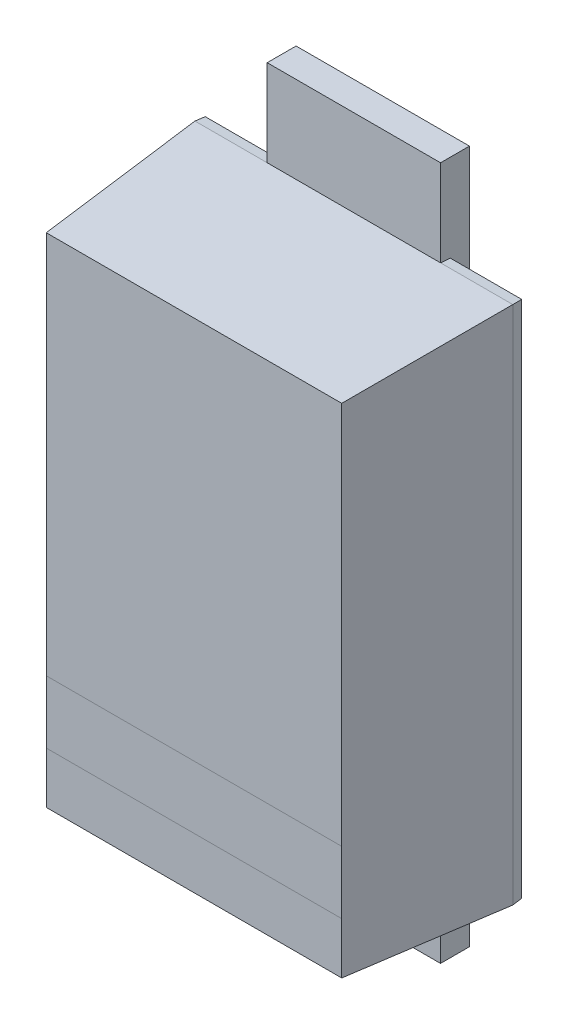
ISO-10303-21;
HEADER;
FILE_DESCRIPTION(('STEP AP214'),'2;1');
FILE_NAME('part.step','',(''),(''),'','','');
FILE_SCHEMA(('AUTOMOTIVE_DESIGN { 1 0 10303 214 1 1 1 1 }'));
ENDSEC;
DATA;
#1=APPLICATION_CONTEXT('core data for automotive mechanical design processes');
#2=APPLICATION_PROTOCOL_DEFINITION('international standard','automotive_design',2000,#1);
#3=PRODUCT_CONTEXT('',#1,'mechanical');
#4=PRODUCT('Part','Part','',(#3));
#5=PRODUCT_RELATED_PRODUCT_CATEGORY('part','',(#4));
#6=PRODUCT_DEFINITION_FORMATION('','',#4);
#7=PRODUCT_DEFINITION_CONTEXT('part definition',#1,'design');
#8=PRODUCT_DEFINITION('design','',#6,#7);
#9=PRODUCT_DEFINITION_SHAPE('','',#8);
#10=(LENGTH_UNIT() NAMED_UNIT(*) SI_UNIT(.MILLI.,.METRE.));
#11=(NAMED_UNIT(*) PLANE_ANGLE_UNIT() SI_UNIT($,.RADIAN.));
#12=(NAMED_UNIT(*) SI_UNIT($,.STERADIAN.) SOLID_ANGLE_UNIT());
#13=UNCERTAINTY_MEASURE_WITH_UNIT(LENGTH_MEASURE(1.E-05),#10,'distance_accuracy_value','');
#14=(GEOMETRIC_REPRESENTATION_CONTEXT(3) GLOBAL_UNCERTAINTY_ASSIGNED_CONTEXT((#13)) GLOBAL_UNIT_ASSIGNED_CONTEXT((#10,
#11,#12)) REPRESENTATION_CONTEXT('',''));
#15=CARTESIAN_POINT('',(0.,0.,0.));
#16=DIRECTION('',(0.,0.,1.));
#17=DIRECTION('',(1.,0.,0.));
#18=AXIS2_PLACEMENT_3D('',#15,#16,#17);
#19=CARTESIAN_POINT('',(16.9501000976563,42.6,0.));
#20=DIRECTION('',(0.,0.,1.));
#21=DIRECTION('',(0.,-1.,0.));
#22=AXIS2_PLACEMENT_3D('',#19,#20,#21);
#23=PLANE('',#22);
#24=DIRECTION('',(1.,0.,0.));
#25=VECTOR('',#24,1.);
#26=CARTESIAN_POINT('',(16.9501000976563,43.35,0.));
#27=LINE('',#26,#25);
#28=CARTESIAN_POINT('',(16.0501000976563,43.35,0.));
#29=VERTEX_POINT('',#28);
#30=CARTESIAN_POINT('',(16.9501000976563,43.35,0.));
#31=VERTEX_POINT('',#30);
#32=EDGE_CURVE('P0_E20',#29,#31,#27,.T.);
#33=ORIENTED_EDGE('',*,*,#32,.T.);
#34=DIRECTION('',(0.,1.,0.));
#35=VECTOR('',#34,1.);
#36=CARTESIAN_POINT('',(16.9501000976563,44.4,0.));
#37=LINE('',#36,#35);
#38=CARTESIAN_POINT('',(16.9501000976563,42.6,0.));
#39=VERTEX_POINT('',#38);
#40=EDGE_CURVE('P0_E55',#39,#31,#37,.T.);
#41=ORIENTED_EDGE('',*,*,#40,.F.);
#42=DIRECTION('',(-1.,0.,0.));
#43=VECTOR('',#42,1.);
#44=CARTESIAN_POINT('',(16.9501000976563,42.6,0.));
#45=LINE('',#44,#43);
#46=CARTESIAN_POINT('',(16.0501000976563,42.6,0.));
#47=VERTEX_POINT('',#46);
#48=EDGE_CURVE('P0_E76',#39,#47,#45,.T.);
#49=ORIENTED_EDGE('',*,*,#48,.T.);
#50=DIRECTION('',(0.,1.,0.));
#51=VECTOR('',#50,1.);
#52=CARTESIAN_POINT('',(16.0501000976563,44.4,0.));
#53=LINE('',#52,#51);
#54=EDGE_CURVE('P0_E58',#47,#29,#53,.T.);
#55=ORIENTED_EDGE('',*,*,#54,.T.);
#56=EDGE_LOOP('',(#33,#41,#49,#55));
#57=FACE_BOUND('',#56,.T.);
#58=ADVANCED_FACE('P0_F17',(#57),#23,.F.);
#59=CARTESIAN_POINT('',(16.9501000976563,43.35,0.));
#60=DIRECTION('',(0.,-1.,0.));
#61=DIRECTION('',(1.,0.,0.));
#62=AXIS2_PLACEMENT_3D('',#59,#60,#61);
#63=PLANE('',#62);
#64=DIRECTION('',(1.,0.,0.));
#65=VECTOR('',#64,1.);
#66=CARTESIAN_POINT('',(16.9501000976563,43.35,0.14999999999996));
#67=LINE('',#66,#65);
#68=CARTESIAN_POINT('',(16.0501000976563,43.35,0.14999999999996));
#69=VERTEX_POINT('',#68);
#70=CARTESIAN_POINT('',(16.9501000976563,43.35,0.14999999999996));
#71=VERTEX_POINT('',#70);
#72=EDGE_CURVE('P0_E73',#69,#71,#67,.T.);
#73=ORIENTED_EDGE('',*,*,#72,.T.);
#74=DIRECTION('',(0.,0.,-1.));
#75=VECTOR('',#74,1.);
#76=CARTESIAN_POINT('',(16.9501000976563,43.35,0.));
#77=LINE('',#76,#75);
#78=EDGE_CURVE('P0_E63',#31,#71,#77,.F.);
#79=ORIENTED_EDGE('',*,*,#78,.F.);
#80=ORIENTED_EDGE('',*,*,#32,.F.);
#81=DIRECTION('',(0.,0.,-1.));
#82=VECTOR('',#81,1.);
#83=CARTESIAN_POINT('',(16.0501000976563,43.35,0.));
#84=LINE('',#83,#82);
#85=EDGE_CURVE('P0_E80',#29,#69,#84,.F.);
#86=ORIENTED_EDGE('',*,*,#85,.T.);
#87=EDGE_LOOP('',(#73,#79,#80,#86));
#88=FACE_BOUND('',#87,.T.);
#89=ADVANCED_FACE('P0_F72',(#88),#63,.F.);
#90=CARTESIAN_POINT('',(16.9501000976563,44.4,0.));
#91=DIRECTION('',(1.,0.,0.));
#92=DIRECTION('',(0.,0.,-1.));
#93=AXIS2_PLACEMENT_3D('',#90,#91,#92);
#94=PLANE('',#93);
#95=DIRECTION('',(0.,0.,1.));
#96=VECTOR('',#95,1.);
#97=CARTESIAN_POINT('',(16.9501000976563,42.6,0.14999999999996));
#98=LINE('',#97,#96);
#99=CARTESIAN_POINT('',(16.9501000976563,42.6,0.14999999999996));
#100=VERTEX_POINT('',#99);
#101=EDGE_CURVE('P0_E69',#100,#39,#98,.F.);
#102=ORIENTED_EDGE('',*,*,#101,.T.);
#103=ORIENTED_EDGE('',*,*,#40,.T.);
#104=ORIENTED_EDGE('',*,*,#78,.T.);
#105=DIRECTION('',(0.,1.,0.));
#106=VECTOR('',#105,1.);
#107=CARTESIAN_POINT('',(16.9501000976563,43.35,0.14999999999996));
#108=LINE('',#107,#106);
#109=EDGE_CURVE('P0_E83',#71,#100,#108,.F.);
#110=ORIENTED_EDGE('',*,*,#109,.T.);
#111=EDGE_LOOP('',(#102,#103,#104,#110));
#112=FACE_BOUND('',#111,.T.);
#113=ADVANCED_FACE('P0_F66',(#112),#94,.T.);
#114=CARTESIAN_POINT('',(16.9501000976563,42.6,0.14999999999996));
#115=DIRECTION('',(0.,1.,0.));
#116=DIRECTION('',(-1.,0.,0.));
#117=AXIS2_PLACEMENT_3D('',#114,#115,#116);
#118=PLANE('',#117);
#119=ORIENTED_EDGE('',*,*,#48,.F.);
#120=ORIENTED_EDGE('',*,*,#101,.F.);
#121=DIRECTION('',(1.,0.,0.));
#122=VECTOR('',#121,1.);
#123=CARTESIAN_POINT('',(16.9501000976563,42.6,0.14999999999996));
#124=LINE('',#123,#122);
#125=CARTESIAN_POINT('',(16.0501000976563,42.6,0.14999999999996));
#126=VERTEX_POINT('',#125);
#127=EDGE_CURVE('P0_E26',#100,#126,#124,.F.);
#128=ORIENTED_EDGE('',*,*,#127,.T.);
#129=DIRECTION('',(0.,0.,-1.));
#130=VECTOR('',#129,1.);
#131=CARTESIAN_POINT('',(16.0501000976563,42.6,0.));
#132=LINE('',#131,#130);
#133=EDGE_CURVE('P0_E34',#126,#47,#132,.T.);
#134=ORIENTED_EDGE('',*,*,#133,.T.);
#135=EDGE_LOOP('',(#119,#120,#128,#134));
#136=FACE_BOUND('',#135,.T.);
#137=ADVANCED_FACE('P0_F88',(#136),#118,.F.);
#138=CARTESIAN_POINT('',(16.0501000976563,44.4,0.));
#139=DIRECTION('',(1.,0.,0.));
#140=DIRECTION('',(0.,0.,-1.));
#141=AXIS2_PLACEMENT_3D('',#138,#139,#140);
#142=PLANE('',#141);
#143=ORIENTED_EDGE('',*,*,#54,.F.);
#144=ORIENTED_EDGE('',*,*,#133,.F.);
#145=DIRECTION('',(0.,1.,0.));
#146=VECTOR('',#145,1.);
#147=CARTESIAN_POINT('',(16.0501000976563,43.35,0.14999999999996));
#148=LINE('',#147,#146);
#149=EDGE_CURVE('P0_E11',#126,#69,#148,.T.);
#150=ORIENTED_EDGE('',*,*,#149,.T.);
#151=ORIENTED_EDGE('',*,*,#85,.F.);
#152=EDGE_LOOP('',(#143,#144,#150,#151));
#153=FACE_BOUND('',#152,.T.);
#154=ADVANCED_FACE('P0_F91',(#153),#142,.F.);
#155=CARTESIAN_POINT('',(16.9501000976563,43.35,0.14999999999996));
#156=DIRECTION('',(0.,0.,-1.));
#157=DIRECTION('',(0.,1.,0.));
#158=AXIS2_PLACEMENT_3D('',#155,#156,#157);
#159=PLANE('',#158);
#160=ORIENTED_EDGE('',*,*,#127,.F.);
#161=ORIENTED_EDGE('',*,*,#109,.F.);
#162=ORIENTED_EDGE('',*,*,#72,.F.);
#163=ORIENTED_EDGE('',*,*,#149,.F.);
#164=EDGE_LOOP('',(#160,#161,#162,#163));
#165=FACE_BOUND('',#164,.T.);
#166=ADVANCED_FACE('P0_F90',(#165),#159,.F.);
#167=CLOSED_SHELL('',(#58,#89,#113,#137,#154,#166));
#168=MANIFOLD_SOLID_BREP('P0_B1',#167);
#169=CARTESIAN_POINT('',(16.5001000976563,44.4,0.93));
#170=DIRECTION('',(0.,0.,1.));
#171=DIRECTION('',(1.,0.,0.));
#172=AXIS2_PLACEMENT_3D('',#169,#170,#171);
#173=PLANE('',#172);
#174=DIRECTION('',(0.,1.,0.));
#175=VECTOR('',#174,1.);
#176=CARTESIAN_POINT('',(15.7331393515694,44.4,0.93));
#177=LINE('',#176,#175);
#178=CARTESIAN_POINT('',(15.7331393515694,43.7,0.93));
#179=VERTEX_POINT('',#178);
#180=CARTESIAN_POINT('',(15.7331393515694,43.375,0.93));
#181=VERTEX_POINT('',#180);
#182=EDGE_CURVE('P1_E20',#179,#181,#177,.F.);
#183=ORIENTED_EDGE('',*,*,#182,.F.);
#184=DIRECTION('',(-1.,0.,0.));
#185=VECTOR('',#184,1.);
#186=CARTESIAN_POINT('',(15.7331393515694,43.7,0.93));
#187=LINE('',#186,#185);
#188=CARTESIAN_POINT('',(17.2670608437431,43.7,0.93));
#189=VERTEX_POINT('',#188);
#190=EDGE_CURVE('P1_E55',#189,#179,#187,.T.);
#191=ORIENTED_EDGE('',*,*,#190,.F.);
#192=DIRECTION('',(0.,1.,0.));
#193=VECTOR('',#192,1.);
#194=CARTESIAN_POINT('',(17.2670608437431,43.375,0.93));
#195=LINE('',#194,#193);
#196=CARTESIAN_POINT('',(17.2670608437431,43.375,0.93));
#197=VERTEX_POINT('',#196);
#198=EDGE_CURVE('P1_E58',#197,#189,#195,.T.);
#199=ORIENTED_EDGE('',*,*,#198,.F.);
#200=DIRECTION('',(1.,0.,0.));
#201=VECTOR('',#200,1.);
#202=CARTESIAN_POINT('',(15.7331393515694,43.375,0.93));
#203=LINE('',#202,#201);
#204=EDGE_CURVE('P1_E60',#181,#197,#203,.T.);
#205=ORIENTED_EDGE('',*,*,#204,.F.);
#206=EDGE_LOOP('',(#183,#191,#199,#205));
#207=FACE_BOUND('',#206,.T.);
#208=ADVANCED_FACE('P1_F17',(#207),#173,.F.);
#209=CARTESIAN_POINT('',(15.7331393515694,43.375,-0.637973260024741));
#210=DIRECTION('',(0.,-1.,0.));
#211=DIRECTION('',(1.,0.,0.));
#212=AXIS2_PLACEMENT_3D('',#209,#210,#211);
#213=PLANE('',#212);
#214=DIRECTION('',(1.,0.,0.));
#215=VECTOR('',#214,1.);
#216=CARTESIAN_POINT('',(16.5001000976563,43.375,0.98));
#217=LINE('',#216,#215);
#218=CARTESIAN_POINT('',(15.7331393515694,43.375,0.98));
#219=VERTEX_POINT('',#218);
#220=CARTESIAN_POINT('',(17.2670608437431,43.375,0.98));
#221=VERTEX_POINT('',#220);
#222=EDGE_CURVE('P1_E83',#219,#221,#217,.T.);
#223=ORIENTED_EDGE('',*,*,#222,.F.);
#224=DIRECTION('',(0.,0.,1.));
#225=VECTOR('',#224,1.);
#226=CARTESIAN_POINT('',(15.7331393515694,43.375,-0.637973260024741));
#227=LINE('',#226,#225);
#228=EDGE_CURVE('P1_E71',#181,#219,#227,.T.);
#229=ORIENTED_EDGE('',*,*,#228,.F.);
#230=ORIENTED_EDGE('',*,*,#204,.T.);
#231=DIRECTION('',(0.,0.,-1.));
#232=VECTOR('',#231,1.);
#233=CARTESIAN_POINT('',(17.2670608437431,43.375,-0.637973260024741));
#234=LINE('',#233,#232);
#235=EDGE_CURVE('P1_E65',#221,#197,#234,.T.);
#236=ORIENTED_EDGE('',*,*,#235,.F.);
#237=EDGE_LOOP('',(#223,#229,#230,#236));
#238=FACE_BOUND('',#237,.T.);
#239=ADVANCED_FACE('P1_F68',(#238),#213,.T.);
#240=CARTESIAN_POINT('',(17.2670608437431,43.375,-0.637973260024741));
#241=DIRECTION('',(1.,0.,0.));
#242=DIRECTION('',(0.,0.,-1.));
#243=AXIS2_PLACEMENT_3D('',#240,#241,#242);
#244=PLANE('',#243);
#245=DIRECTION('',(0.,1.,0.));
#246=VECTOR('',#245,1.);
#247=CARTESIAN_POINT('',(17.2670608437431,44.4,0.98));
#248=LINE('',#247,#246);
#249=CARTESIAN_POINT('',(17.2670608437431,43.7,0.98));
#250=VERTEX_POINT('',#249);
#251=EDGE_CURVE('P1_E74',#221,#250,#248,.T.);
#252=ORIENTED_EDGE('',*,*,#251,.F.);
#253=ORIENTED_EDGE('',*,*,#235,.T.);
#254=ORIENTED_EDGE('',*,*,#198,.T.);
#255=DIRECTION('',(0.,0.,1.));
#256=VECTOR('',#255,1.);
#257=CARTESIAN_POINT('',(17.2670608437431,43.7,-0.637973260024741));
#258=LINE('',#257,#256);
#259=EDGE_CURVE('P1_E77',#250,#189,#258,.F.);
#260=ORIENTED_EDGE('',*,*,#259,.F.);
#261=EDGE_LOOP('',(#252,#253,#254,#260));
#262=FACE_BOUND('',#261,.T.);
#263=ADVANCED_FACE('P1_F72',(#262),#244,.T.);
#264=CARTESIAN_POINT('',(15.7331393515694,43.7,-0.637973260024741));
#265=DIRECTION('',(0.,1.,0.));
#266=DIRECTION('',(-1.,0.,0.));
#267=AXIS2_PLACEMENT_3D('',#264,#265,#266);
#268=PLANE('',#267);
#269=DIRECTION('',(1.,0.,0.));
#270=VECTOR('',#269,1.);
#271=CARTESIAN_POINT('',(16.5001000976563,43.7,0.98));
#272=LINE('',#271,#270);
#273=CARTESIAN_POINT('',(15.7331393515694,43.7,0.98));
#274=VERTEX_POINT('',#273);
#275=EDGE_CURVE('P1_E26',#250,#274,#272,.F.);
#276=ORIENTED_EDGE('',*,*,#275,.F.);
#277=ORIENTED_EDGE('',*,*,#259,.T.);
#278=ORIENTED_EDGE('',*,*,#190,.T.);
#279=DIRECTION('',(0.,0.,1.));
#280=VECTOR('',#279,1.);
#281=CARTESIAN_POINT('',(15.7331393515694,43.7,-0.637973260024741));
#282=LINE('',#281,#280);
#283=EDGE_CURVE('P1_E35',#274,#179,#282,.F.);
#284=ORIENTED_EDGE('',*,*,#283,.F.);
#285=EDGE_LOOP('',(#276,#277,#278,#284));
#286=FACE_BOUND('',#285,.T.);
#287=ADVANCED_FACE('P1_F89',(#286),#268,.T.);
#288=CARTESIAN_POINT('',(15.7331393515694,43.375,-0.637973260024741));
#289=DIRECTION('',(-1.,0.,0.));
#290=DIRECTION('',(0.,0.,1.));
#291=AXIS2_PLACEMENT_3D('',#288,#289,#290);
#292=PLANE('',#291);
#293=DIRECTION('',(0.,1.,0.));
#294=VECTOR('',#293,1.);
#295=CARTESIAN_POINT('',(15.7331393515694,44.4,0.98));
#296=LINE('',#295,#294);
#297=EDGE_CURVE('P1_E11',#274,#219,#296,.F.);
#298=ORIENTED_EDGE('',*,*,#297,.F.);
#299=ORIENTED_EDGE('',*,*,#283,.T.);
#300=ORIENTED_EDGE('',*,*,#182,.T.);
#301=ORIENTED_EDGE('',*,*,#228,.T.);
#302=EDGE_LOOP('',(#298,#299,#300,#301));
#303=FACE_BOUND('',#302,.T.);
#304=ADVANCED_FACE('P1_F91',(#303),#292,.T.);
#305=CARTESIAN_POINT('',(16.5001000976563,44.4,0.98));
#306=DIRECTION('',(0.,0.,1.));
#307=DIRECTION('',(1.,0.,0.));
#308=AXIS2_PLACEMENT_3D('',#305,#306,#307);
#309=PLANE('',#308);
#310=ORIENTED_EDGE('',*,*,#275,.T.);
#311=ORIENTED_EDGE('',*,*,#297,.T.);
#312=ORIENTED_EDGE('',*,*,#222,.T.);
#313=ORIENTED_EDGE('',*,*,#251,.T.);
#314=EDGE_LOOP('',(#310,#311,#312,#313));
#315=FACE_BOUND('',#314,.T.);
#316=ADVANCED_FACE('P1_F88',(#315),#309,.T.);
#317=CLOSED_SHELL('',(#208,#239,#263,#287,#304,#316));
#318=MANIFOLD_SOLID_BREP('P1_B1',#317);
#319=CARTESIAN_POINT('',(16.9501000976563,45.45,0.14999999999996));
#320=DIRECTION('',(0.,0.,-1.));
#321=DIRECTION('',(0.,1.,0.));
#322=AXIS2_PLACEMENT_3D('',#319,#320,#321);
#323=PLANE('',#322);
#324=DIRECTION('',(-1.,0.,0.));
#325=VECTOR('',#324,1.);
#326=CARTESIAN_POINT('',(16.9501000976563,45.45,0.14999999999996));
#327=LINE('',#326,#325);
#328=CARTESIAN_POINT('',(16.0501000976563,45.45,0.14999999999996));
#329=VERTEX_POINT('',#328);
#330=CARTESIAN_POINT('',(16.9501000976563,45.45,0.14999999999996));
#331=VERTEX_POINT('',#330);
#332=EDGE_CURVE('P2_E20',#329,#331,#327,.F.);
#333=ORIENTED_EDGE('',*,*,#332,.T.);
#334=DIRECTION('',(0.,1.,0.));
#335=VECTOR('',#334,1.);
#336=CARTESIAN_POINT('',(16.9501000976563,44.4,0.14999999999996));
#337=LINE('',#336,#335);
#338=CARTESIAN_POINT('',(16.9501000976563,46.2,0.14999999999996));
#339=VERTEX_POINT('',#338);
#340=EDGE_CURVE('P2_E55',#331,#339,#337,.T.);
#341=ORIENTED_EDGE('',*,*,#340,.T.);
#342=DIRECTION('',(1.,0.,0.));
#343=VECTOR('',#342,1.);
#344=CARTESIAN_POINT('',(16.9501000976563,46.2,0.14999999999996));
#345=LINE('',#344,#343);
#346=CARTESIAN_POINT('',(16.0501000976563,46.2,0.14999999999996));
#347=VERTEX_POINT('',#346);
#348=EDGE_CURVE('P2_E76',#339,#347,#345,.F.);
#349=ORIENTED_EDGE('',*,*,#348,.T.);
#350=DIRECTION('',(0.,1.,0.));
#351=VECTOR('',#350,1.);
#352=CARTESIAN_POINT('',(16.0501000976563,44.4,0.14999999999996));
#353=LINE('',#352,#351);
#354=EDGE_CURVE('P2_E58',#329,#347,#353,.T.);
#355=ORIENTED_EDGE('',*,*,#354,.F.);
#356=EDGE_LOOP('',(#333,#341,#349,#355));
#357=FACE_BOUND('',#356,.T.);
#358=ADVANCED_FACE('P2_F17',(#357),#323,.F.);
#359=CARTESIAN_POINT('',(16.9501000976563,45.45,0.));
#360=DIRECTION('',(0.,1.,0.));
#361=DIRECTION('',(-1.,0.,0.));
#362=AXIS2_PLACEMENT_3D('',#359,#360,#361);
#363=PLANE('',#362);
#364=DIRECTION('',(1.,0.,0.));
#365=VECTOR('',#364,1.);
#366=CARTESIAN_POINT('',(16.9501000976563,45.45,0.));
#367=LINE('',#366,#365);
#368=CARTESIAN_POINT('',(16.0501000976563,45.45,0.));
#369=VERTEX_POINT('',#368);
#370=CARTESIAN_POINT('',(16.9501000976563,45.45,0.));
#371=VERTEX_POINT('',#370);
#372=EDGE_CURVE('P2_E73',#369,#371,#367,.T.);
#373=ORIENTED_EDGE('',*,*,#372,.T.);
#374=DIRECTION('',(0.,0.,1.));
#375=VECTOR('',#374,1.);
#376=CARTESIAN_POINT('',(16.9501000976563,45.45,0.));
#377=LINE('',#376,#375);
#378=EDGE_CURVE('P2_E63',#371,#331,#377,.T.);
#379=ORIENTED_EDGE('',*,*,#378,.T.);
#380=ORIENTED_EDGE('',*,*,#332,.F.);
#381=DIRECTION('',(0.,0.,1.));
#382=VECTOR('',#381,1.);
#383=CARTESIAN_POINT('',(16.0501000976563,45.45,0.));
#384=LINE('',#383,#382);
#385=EDGE_CURVE('P2_E78',#369,#329,#384,.T.);
#386=ORIENTED_EDGE('',*,*,#385,.F.);
#387=EDGE_LOOP('',(#373,#379,#380,#386));
#388=FACE_BOUND('',#387,.T.);
#389=ADVANCED_FACE('P2_F72',(#388),#363,.F.);
#390=CARTESIAN_POINT('',(16.9501000976563,44.4,0.));
#391=DIRECTION('',(-1.,0.,0.));
#392=DIRECTION('',(0.,0.,1.));
#393=AXIS2_PLACEMENT_3D('',#390,#391,#392);
#394=PLANE('',#393);
#395=DIRECTION('',(0.,0.,1.));
#396=VECTOR('',#395,1.);
#397=CARTESIAN_POINT('',(16.9501000976563,46.2,0.14999999999996));
#398=LINE('',#397,#396);
#399=CARTESIAN_POINT('',(16.9501000976563,46.2,0.));
#400=VERTEX_POINT('',#399);
#401=EDGE_CURVE('P2_E69',#400,#339,#398,.T.);
#402=ORIENTED_EDGE('',*,*,#401,.T.);
#403=ORIENTED_EDGE('',*,*,#340,.F.);
#404=ORIENTED_EDGE('',*,*,#378,.F.);
#405=DIRECTION('',(0.,-1.,0.));
#406=VECTOR('',#405,1.);
#407=CARTESIAN_POINT('',(16.9501000976563,46.2,0.));
#408=LINE('',#407,#406);
#409=EDGE_CURVE('P2_E83',#371,#400,#408,.F.);
#410=ORIENTED_EDGE('',*,*,#409,.T.);
#411=EDGE_LOOP('',(#402,#403,#404,#410));
#412=FACE_BOUND('',#411,.T.);
#413=ADVANCED_FACE('P2_F66',(#412),#394,.F.);
#414=CARTESIAN_POINT('',(16.9501000976563,46.2,0.14999999999996));
#415=DIRECTION('',(0.,-1.,0.));
#416=DIRECTION('',(1.,0.,0.));
#417=AXIS2_PLACEMENT_3D('',#414,#415,#416);
#418=PLANE('',#417);
#419=ORIENTED_EDGE('',*,*,#348,.F.);
#420=ORIENTED_EDGE('',*,*,#401,.F.);
#421=DIRECTION('',(1.,0.,0.));
#422=VECTOR('',#421,1.);
#423=CARTESIAN_POINT('',(16.9501000976563,46.2,0.));
#424=LINE('',#423,#422);
#425=CARTESIAN_POINT('',(16.0501000976563,46.2,0.));
#426=VERTEX_POINT('',#425);
#427=EDGE_CURVE('P2_E26',#400,#426,#424,.F.);
#428=ORIENTED_EDGE('',*,*,#427,.T.);
#429=DIRECTION('',(0.,0.,1.));
#430=VECTOR('',#429,1.);
#431=CARTESIAN_POINT('',(16.0501000976563,46.2,0.));
#432=LINE('',#431,#430);
#433=EDGE_CURVE('P2_E34',#347,#426,#432,.F.);
#434=ORIENTED_EDGE('',*,*,#433,.F.);
#435=EDGE_LOOP('',(#419,#420,#428,#434));
#436=FACE_BOUND('',#435,.T.);
#437=ADVANCED_FACE('P2_F88',(#436),#418,.F.);
#438=CARTESIAN_POINT('',(16.0501000976563,44.4,0.));
#439=DIRECTION('',(-1.,0.,0.));
#440=DIRECTION('',(0.,0.,1.));
#441=AXIS2_PLACEMENT_3D('',#438,#439,#440);
#442=PLANE('',#441);
#443=ORIENTED_EDGE('',*,*,#354,.T.);
#444=ORIENTED_EDGE('',*,*,#433,.T.);
#445=DIRECTION('',(0.,-1.,0.));
#446=VECTOR('',#445,1.);
#447=CARTESIAN_POINT('',(16.0501000976563,46.2,0.));
#448=LINE('',#447,#446);
#449=EDGE_CURVE('P2_E11',#426,#369,#448,.T.);
#450=ORIENTED_EDGE('',*,*,#449,.T.);
#451=ORIENTED_EDGE('',*,*,#385,.T.);
#452=EDGE_LOOP('',(#443,#444,#450,#451));
#453=FACE_BOUND('',#452,.T.);
#454=ADVANCED_FACE('P2_F91',(#453),#442,.T.);
#455=CARTESIAN_POINT('',(16.9501000976563,46.2,0.));
#456=DIRECTION('',(0.,0.,1.));
#457=DIRECTION('',(0.,-1.,0.));
#458=AXIS2_PLACEMENT_3D('',#455,#456,#457);
#459=PLANE('',#458);
#460=ORIENTED_EDGE('',*,*,#427,.F.);
#461=ORIENTED_EDGE('',*,*,#409,.F.);
#462=ORIENTED_EDGE('',*,*,#372,.F.);
#463=ORIENTED_EDGE('',*,*,#449,.F.);
#464=EDGE_LOOP('',(#460,#461,#462,#463));
#465=FACE_BOUND('',#464,.T.);
#466=ADVANCED_FACE('P2_F90',(#465),#459,.F.);
#467=CLOSED_SHELL('',(#358,#389,#413,#437,#454,#466));
#468=MANIFOLD_SOLID_BREP('P2_B1',#467);
#469=CARTESIAN_POINT('',(16.5001000976563,44.4,0.93));
#470=DIRECTION('',(0.,0.,1.));
#471=DIRECTION('',(1.,0.,0.));
#472=AXIS2_PLACEMENT_3D('',#469,#470,#471);
#473=PLANE('',#472);
#474=DIRECTION('',(-1.,0.,0.));
#475=VECTOR('',#474,1.);
#476=CARTESIAN_POINT('',(15.7331393515694,43.7,0.93));
#477=LINE('',#476,#475);
#478=CARTESIAN_POINT('',(17.2670608437431,43.7,0.93));
#479=VERTEX_POINT('',#478);
#480=CARTESIAN_POINT('',(15.7331393515694,43.7,0.93));
#481=VERTEX_POINT('',#480);
#482=EDGE_CURVE('P3_E161',#479,#481,#477,.T.);
#483=ORIENTED_EDGE('',*,*,#482,.T.);
#484=DIRECTION('',(0.,1.,0.));
#485=VECTOR('',#484,1.);
#486=CARTESIAN_POINT('',(15.7331393515694,44.4,0.93));
#487=LINE('',#486,#485);
#488=CARTESIAN_POINT('',(15.7331393515694,43.375,0.93));
#489=VERTEX_POINT('',#488);
#490=EDGE_CURVE('P3_E148',#481,#489,#487,.F.);
#491=ORIENTED_EDGE('',*,*,#490,.T.);
#492=DIRECTION('',(1.,0.,0.));
#493=VECTOR('',#492,1.);
#494=CARTESIAN_POINT('',(15.7331393515694,43.375,0.93));
#495=LINE('',#494,#493);
#496=CARTESIAN_POINT('',(17.2670608437431,43.375,0.93));
#497=VERTEX_POINT('',#496);
#498=EDGE_CURVE('P3_E156',#489,#497,#495,.T.);
#499=ORIENTED_EDGE('',*,*,#498,.T.);
#500=DIRECTION('',(0.,1.,0.));
#501=VECTOR('',#500,1.);
#502=CARTESIAN_POINT('',(17.2670608437431,44.4,0.93));
#503=LINE('',#502,#501);
#504=EDGE_CURVE('P3_E20',#497,#479,#503,.T.);
#505=ORIENTED_EDGE('',*,*,#504,.T.);
#506=EDGE_LOOP('',(#483,#491,#499,#505));
#507=FACE_BOUND('',#506,.T.);
#508=ADVANCED_FACE('P3_F17',(#507),#473,.T.);
#509=CARTESIAN_POINT('',(15.7331393515694,43.375,0.93));
#510=DIRECTION('',(0.,-1.,0.));
#511=DIRECTION('',(1.,0.,0.));
#512=AXIS2_PLACEMENT_3D('',#509,#510,#511);
#513=PLANE('',#512);
#514=DIRECTION('',(0.,0.,1.));
#515=VECTOR('',#514,1.);
#516=CARTESIAN_POINT('',(17.2670608437431,43.375,0.93));
#517=LINE('',#516,#515);
#518=CARTESIAN_POINT('',(17.2670608437431,43.375,0.980000000000001));
#519=VERTEX_POINT('',#518);
#520=EDGE_CURVE('P3_E164',#497,#519,#517,.T.);
#521=ORIENTED_EDGE('',*,*,#520,.F.);
#522=ORIENTED_EDGE('',*,*,#498,.F.);
#523=DIRECTION('',(0.,0.,1.));
#524=VECTOR('',#523,1.);
#525=CARTESIAN_POINT('',(15.7331393515694,43.375,0.93));
#526=LINE('',#525,#524);
#527=CARTESIAN_POINT('',(15.7331393515694,43.375,0.98));
#528=VERTEX_POINT('',#527);
#529=EDGE_CURVE('P3_E144',#528,#489,#526,.F.);
#530=ORIENTED_EDGE('',*,*,#529,.F.);
#531=DIRECTION('',(-1.,0.,0.));
#532=VECTOR('',#531,1.);
#533=CARTESIAN_POINT('',(17.3251000976563,43.375,0.98));
#534=LINE('',#533,#532);
#535=EDGE_CURVE('P3_E173',#528,#519,#534,.F.);
#536=ORIENTED_EDGE('',*,*,#535,.T.);
#537=EDGE_LOOP('',(#521,#522,#530,#536));
#538=FACE_BOUND('',#537,.T.);
#539=ADVANCED_FACE('P3_F163',(#538),#513,.F.);
#540=CARTESIAN_POINT('',(15.7331393515694,43.7,0.93));
#541=DIRECTION('',(0.,1.,0.));
#542=DIRECTION('',(-1.,0.,0.));
#543=AXIS2_PLACEMENT_3D('',#540,#541,#542);
#544=PLANE('',#543);
#545=DIRECTION('',(0.,0.,1.));
#546=VECTOR('',#545,1.);
#547=CARTESIAN_POINT('',(15.7331393515694,43.7,0.93));
#548=LINE('',#547,#546);
#549=CARTESIAN_POINT('',(15.7331393515694,43.7,0.98));
#550=VERTEX_POINT('',#549);
#551=EDGE_CURVE('P3_E177',#550,#481,#548,.F.);
#552=ORIENTED_EDGE('',*,*,#551,.T.);
#553=ORIENTED_EDGE('',*,*,#482,.F.);
#554=DIRECTION('',(0.,0.,1.));
#555=VECTOR('',#554,1.);
#556=CARTESIAN_POINT('',(17.2670608437431,43.7,0.93));
#557=LINE('',#556,#555);
#558=CARTESIAN_POINT('',(17.2670608437431,43.7,0.980000000000001));
#559=VERTEX_POINT('',#558);
#560=EDGE_CURVE('P3_E166',#559,#479,#557,.F.);
#561=ORIENTED_EDGE('',*,*,#560,.F.);
#562=DIRECTION('',(-1.,0.,0.));
#563=VECTOR('',#562,1.);
#564=CARTESIAN_POINT('',(17.3251000976563,43.7,0.98));
#565=LINE('',#564,#563);
#566=EDGE_CURVE('P3_E185',#559,#550,#565,.T.);
#567=ORIENTED_EDGE('',*,*,#566,.T.);
#568=EDGE_LOOP('',(#552,#553,#561,#567));
#569=FACE_BOUND('',#568,.T.);
#570=ADVANCED_FACE('P3_F375',(#569),#544,.F.);
#571=CARTESIAN_POINT('',(17.3251000976563,43.05,0.98));
#572=DIRECTION('',(0.,0.,-1.));
#573=DIRECTION('',(-1.,0.,0.));
#574=AXIS2_PLACEMENT_3D('',#571,#572,#573);
#575=PLANE('',#574);
#576=ORIENTED_EDGE('',*,*,#535,.F.);
#577=DIRECTION('',(0.,1.,0.));
#578=VECTOR('',#577,1.);
#579=CARTESIAN_POINT('',(15.7331393515694,43.05,0.98));
#580=LINE('',#579,#578);
#581=CARTESIAN_POINT('',(15.7331393515694,43.1080392539131,0.98));
#582=VERTEX_POINT('',#581);
#583=EDGE_CURVE('P3_E171',#582,#528,#580,.T.);
#584=ORIENTED_EDGE('',*,*,#583,.F.);
#585=DIRECTION('',(1.,0.,0.));
#586=VECTOR('',#585,1.);
#587=CARTESIAN_POINT('',(17.3251000976563,43.1080392539131,0.979999999999999));
#588=LINE('',#587,#586);
#589=CARTESIAN_POINT('',(17.2670608437431,43.1080392539131,0.980000000000001));
#590=VERTEX_POINT('',#589);
#591=EDGE_CURVE('P3_E187',#582,#590,#588,.T.);
#592=ORIENTED_EDGE('',*,*,#591,.T.);
#593=DIRECTION('',(0.,1.,0.));
#594=VECTOR('',#593,1.);
#595=CARTESIAN_POINT('',(17.2670608437431,43.05,0.98));
#596=LINE('',#595,#594);
#597=EDGE_CURVE('P3_E175',#519,#590,#596,.F.);
#598=ORIENTED_EDGE('',*,*,#597,.F.);
#599=EDGE_LOOP('',(#576,#584,#592,#598));
#600=FACE_BOUND('',#599,.T.);
#601=ADVANCED_FACE('P3_F373',(#600),#575,.F.);
#602=CARTESIAN_POINT('',(15.7331393515694,43.375,0.93));
#603=DIRECTION('',(-1.,0.,0.));
#604=DIRECTION('',(0.,0.,1.));
#605=AXIS2_PLACEMENT_3D('',#602,#603,#604);
#606=PLANE('',#605);
#607=ORIENTED_EDGE('',*,*,#529,.T.);
#608=ORIENTED_EDGE('',*,*,#490,.F.);
#609=ORIENTED_EDGE('',*,*,#551,.F.);
#610=DIRECTION('',(0.,1.,0.));
#611=VECTOR('',#610,1.);
#612=CARTESIAN_POINT('',(15.7331393515694,43.05,0.98));
#613=LINE('',#612,#611);
#614=EDGE_CURVE('P3_E151',#550,#528,#613,.F.);
#615=ORIENTED_EDGE('',*,*,#614,.T.);
#616=EDGE_LOOP('',(#607,#608,#609,#615));
#617=FACE_BOUND('',#616,.T.);
#618=ADVANCED_FACE('P3_F146',(#617),#606,.F.);
#619=CARTESIAN_POINT('',(17.3251000976563,45.6919607460869,0.98));
#620=DIRECTION('',(0.,-0.997564050259825,-0.0697564737441219));
#621=DIRECTION('',(0.,0.0697564737441219,-0.997564050259825));
#622=AXIS2_PLACEMENT_3D('',#619,#620,#621);
#623=PLANE('',#622);
#624=DIRECTION('',(1.,0.,0.));
#625=VECTOR('',#624,1.);
#626=CARTESIAN_POINT('',(17.3251000976563,45.75,0.14999999999996));
#627=LINE('',#626,#625);
#628=CARTESIAN_POINT('',(16.9501000976563,45.75,0.149999999999959));
#629=VERTEX_POINT('',#628);
#630=CARTESIAN_POINT('',(17.3251000976563,45.75,0.14999999999996));
#631=VERTEX_POINT('',#630);
#632=EDGE_CURVE('P3_E181',#629,#631,#627,.T.);
#633=ORIENTED_EDGE('',*,*,#632,.F.);
#634=DIRECTION('',(1.,0.,0.));
#635=VECTOR('',#634,1.);
#636=CARTESIAN_POINT('',(16.5001000976563,45.75,0.149999999999959));
#637=LINE('',#636,#635);
#638=CARTESIAN_POINT('',(16.0501000976563,45.75,0.149999999999959));
#639=VERTEX_POINT('',#638);
#640=EDGE_CURVE('P3_E203',#629,#639,#637,.F.);
#641=ORIENTED_EDGE('',*,*,#640,.T.);
#642=DIRECTION('',(1.,0.,0.));
#643=VECTOR('',#642,1.);
#644=CARTESIAN_POINT('',(17.3251000976563,45.75,0.149999999999961));
#645=LINE('',#644,#643);
#646=CARTESIAN_POINT('',(15.6751000976562,45.75,0.149999999999959));
#647=VERTEX_POINT('',#646);
#648=EDGE_CURVE('P3_E179',#647,#639,#645,.T.);
#649=ORIENTED_EDGE('',*,*,#648,.F.);
#650=DIRECTION('',(0.0695873743166632,-0.0695873743166465,0.99514581578351));
#651=VECTOR('',#650,1.);
#652=CARTESIAN_POINT('',(15.6751000976563,45.75,0.149999999999954));
#653=LINE('',#652,#651);
#654=CARTESIAN_POINT('',(15.7331393515694,45.6919607460869,0.98));
#655=VERTEX_POINT('',#654);
#656=EDGE_CURVE('P3_E194',#647,#655,#653,.T.);
#657=ORIENTED_EDGE('',*,*,#656,.T.);
#658=DIRECTION('',(-1.,0.,0.));
#659=VECTOR('',#658,1.);
#660=CARTESIAN_POINT('',(17.3251000976563,45.6919607460869,0.98));
#661=LINE('',#660,#659);
#662=CARTESIAN_POINT('',(17.2670608437431,45.6919607460869,0.980000000000001));
#663=VERTEX_POINT('',#662);
#664=EDGE_CURVE('P3_E183',#655,#663,#661,.F.);
#665=ORIENTED_EDGE('',*,*,#664,.T.);
#666=DIRECTION('',(-0.0695873743166632,-0.0695873743166466,0.99514581578351));
#667=VECTOR('',#666,1.);
#668=CARTESIAN_POINT('',(17.3251000976563,45.75,0.14999999999996));
#669=LINE('',#668,#667);
#670=EDGE_CURVE('P3_E209',#631,#663,#669,.T.);
#671=ORIENTED_EDGE('',*,*,#670,.F.);
#672=EDGE_LOOP('',(#633,#641,#649,#657,#665,#671));
#673=FACE_BOUND('',#672,.T.);
#674=ADVANCED_FACE('P3_F367',(#673),#623,.F.);
#675=CARTESIAN_POINT('',(17.3251000976563,43.05,0.98));
#676=DIRECTION('',(0.,0.,-1.));
#677=DIRECTION('',(-1.,0.,0.));
#678=AXIS2_PLACEMENT_3D('',#675,#676,#677);
#679=PLANE('',#678);
#680=ORIENTED_EDGE('',*,*,#566,.F.);
#681=DIRECTION('',(0.,1.,0.));
#682=VECTOR('',#681,1.);
#683=CARTESIAN_POINT('',(17.2670608437432,44.4,0.980000000000006));
#684=LINE('',#683,#682);
#685=EDGE_CURVE('P3_E212',#663,#559,#684,.F.);
#686=ORIENTED_EDGE('',*,*,#685,.F.);
#687=ORIENTED_EDGE('',*,*,#664,.F.);
#688=DIRECTION('',(0.,1.,0.));
#689=VECTOR('',#688,1.);
#690=CARTESIAN_POINT('',(15.7331393515694,43.05,0.98));
#691=LINE('',#690,#689);
#692=EDGE_CURVE('P3_E196',#655,#550,#691,.F.);
#693=ORIENTED_EDGE('',*,*,#692,.T.);
#694=EDGE_LOOP('',(#680,#686,#687,#693));
#695=FACE_BOUND('',#694,.T.);
#696=ADVANCED_FACE('P3_F371',(#695),#679,.F.);
#697=CARTESIAN_POINT('',(17.2670608437431,43.375,0.93));
#698=DIRECTION('',(1.,0.,0.));
#699=DIRECTION('',(0.,0.,-1.));
#700=AXIS2_PLACEMENT_3D('',#697,#698,#699);
#701=PLANE('',#700);
#702=ORIENTED_EDGE('',*,*,#560,.T.);
#703=ORIENTED_EDGE('',*,*,#504,.F.);
#704=ORIENTED_EDGE('',*,*,#520,.T.);
#705=DIRECTION('',(0.,1.,0.));
#706=VECTOR('',#705,1.);
#707=CARTESIAN_POINT('',(17.2670608437432,44.4,0.980000000000006));
#708=LINE('',#707,#706);
#709=EDGE_CURVE('P3_E215',#559,#519,#708,.F.);
#710=ORIENTED_EDGE('',*,*,#709,.F.);
#711=EDGE_LOOP('',(#702,#703,#704,#710));
#712=FACE_BOUND('',#711,.T.);
#713=ADVANCED_FACE('P3_F426',(#712),#701,.F.);
#714=CARTESIAN_POINT('',(17.3251000976563,43.05,0.14999999999996));
#715=DIRECTION('',(0.,0.997564050259825,-0.0697564737441219));
#716=DIRECTION('',(0.,0.0697564737441219,0.997564050259825));
#717=AXIS2_PLACEMENT_3D('',#714,#715,#716);
#718=PLANE('',#717);
#719=DIRECTION('',(1.,0.,0.));
#720=VECTOR('',#719,1.);
#721=CARTESIAN_POINT('',(17.3251000976563,43.05,0.14999999999996));
#722=LINE('',#721,#720);
#723=CARTESIAN_POINT('',(16.0501000976563,43.05,0.14999999999996));
#724=VERTEX_POINT('',#723);
#725=CARTESIAN_POINT('',(15.6751000976562,43.05,0.149999999999959));
#726=VERTEX_POINT('',#725);
#727=EDGE_CURVE('P3_E192',#724,#726,#722,.F.);
#728=ORIENTED_EDGE('',*,*,#727,.F.);
#729=DIRECTION('',(1.,0.,0.));
#730=VECTOR('',#729,1.);
#731=CARTESIAN_POINT('',(16.5001000976563,43.05,0.149999999999959));
#732=LINE('',#731,#730);
#733=CARTESIAN_POINT('',(16.9501000976563,43.05,0.14999999999996));
#734=VERTEX_POINT('',#733);
#735=EDGE_CURVE('P3_E218',#724,#734,#732,.T.);
#736=ORIENTED_EDGE('',*,*,#735,.T.);
#737=DIRECTION('',(1.,0.,0.));
#738=VECTOR('',#737,1.);
#739=CARTESIAN_POINT('',(17.3251000976563,43.05,0.149999999999959));
#740=LINE('',#739,#738);
#741=CARTESIAN_POINT('',(17.3251000976563,43.05,0.149999999999959));
#742=VERTEX_POINT('',#741);
#743=EDGE_CURVE('P3_E190',#742,#734,#740,.F.);
#744=ORIENTED_EDGE('',*,*,#743,.F.);
#745=DIRECTION('',(0.0695873743166631,-0.0695873743166465,-0.99514581578351));
#746=VECTOR('',#745,1.);
#747=CARTESIAN_POINT('',(17.2670608437432,43.1080392539131,0.980000000000006));
#748=LINE('',#747,#746);
#749=EDGE_CURVE('P3_E206',#590,#742,#748,.T.);
#750=ORIENTED_EDGE('',*,*,#749,.F.);
#751=ORIENTED_EDGE('',*,*,#591,.F.);
#752=DIRECTION('',(-0.0695873743166632,-0.0695873743166465,-0.99514581578351));
#753=VECTOR('',#752,1.);
#754=CARTESIAN_POINT('',(15.7331393515694,43.1080392539131,0.98));
#755=LINE('',#754,#753);
#756=EDGE_CURVE('P3_E200',#582,#726,#755,.T.);
#757=ORIENTED_EDGE('',*,*,#756,.T.);
#758=EDGE_LOOP('',(#728,#736,#744,#750,#751,#757));
#759=FACE_BOUND('',#758,.T.);
#760=ADVANCED_FACE('P3_F308',(#759),#718,.F.);
#761=CARTESIAN_POINT('',(15.7331393515694,43.05,0.98));
#762=DIRECTION('',(0.997564050259825,0.,-0.0697564737441218));
#763=DIRECTION('',(-0.0697564737441218,0.,-0.997564050259825));
#764=AXIS2_PLACEMENT_3D('',#761,#762,#763);
#765=PLANE('',#764);
#766=ORIENTED_EDGE('',*,*,#583,.T.);
#767=ORIENTED_EDGE('',*,*,#614,.F.);
#768=ORIENTED_EDGE('',*,*,#692,.F.);
#769=ORIENTED_EDGE('',*,*,#656,.F.);
#770=DIRECTION('',(0.,1.,0.));
#771=VECTOR('',#770,1.);
#772=CARTESIAN_POINT('',(15.6751000976563,43.05,0.149999999999965));
#773=LINE('',#772,#771);
#774=EDGE_CURVE('P3_E225',#647,#726,#773,.F.);
#775=ORIENTED_EDGE('',*,*,#774,.T.);
#776=ORIENTED_EDGE('',*,*,#756,.F.);
#777=EDGE_LOOP('',(#766,#767,#768,#769,#775,#776));
#778=FACE_BOUND('',#777,.T.);
#779=ADVANCED_FACE('P3_F362',(#778),#765,.F.);
#780=CARTESIAN_POINT('',(16.5001000976563,44.4,0.149999999999959));
#781=DIRECTION('',(0.,0.,1.));
#782=DIRECTION('',(0.,-1.,0.));
#783=AXIS2_PLACEMENT_3D('',#780,#781,#782);
#784=PLANE('',#783);
#785=DIRECTION('',(1.,0.,0.));
#786=VECTOR('',#785,1.);
#787=CARTESIAN_POINT('',(16.9501000976563,45.45,0.149999999999959));
#788=LINE('',#787,#786);
#789=CARTESIAN_POINT('',(16.9501000976563,45.45,0.149999999999959));
#790=VERTEX_POINT('',#789);
#791=CARTESIAN_POINT('',(16.0501000976563,45.45,0.149999999999959));
#792=VERTEX_POINT('',#791);
#793=EDGE_CURVE('P3_E237',#790,#792,#788,.F.);
#794=ORIENTED_EDGE('',*,*,#793,.T.);
#795=DIRECTION('',(0.,-1.,0.));
#796=VECTOR('',#795,1.);
#797=CARTESIAN_POINT('',(16.0501000976563,45.45,0.149999999999959));
#798=LINE('',#797,#796);
#799=EDGE_CURVE('P3_E232',#792,#639,#798,.F.);
#800=ORIENTED_EDGE('',*,*,#799,.T.);
#801=ORIENTED_EDGE('',*,*,#640,.F.);
#802=DIRECTION('',(0.,1.,0.));
#803=VECTOR('',#802,1.);
#804=CARTESIAN_POINT('',(16.9501000976563,45.45,0.149999999999959));
#805=LINE('',#804,#803);
#806=EDGE_CURVE('P3_E241',#629,#790,#805,.F.);
#807=ORIENTED_EDGE('',*,*,#806,.T.);
#808=EDGE_LOOP('',(#794,#800,#801,#807));
#809=FACE_BOUND('',#808,.T.);
#810=ADVANCED_FACE('P3_F418',(#809),#784,.F.);
#811=CARTESIAN_POINT('',(17.3251000976563,44.4,0.14999999999996));
#812=DIRECTION('',(0.997564050259825,0.,0.0697564737441219));
#813=DIRECTION('',(0.0697564737441219,0.,-0.997564050259825));
#814=AXIS2_PLACEMENT_3D('',#811,#812,#813);
#815=PLANE('',#814);
#816=ORIENTED_EDGE('',*,*,#709,.T.);
#817=ORIENTED_EDGE('',*,*,#597,.T.);
#818=ORIENTED_EDGE('',*,*,#749,.T.);
#819=DIRECTION('',(0.,1.,0.));
#820=VECTOR('',#819,1.);
#821=CARTESIAN_POINT('',(17.3251000976563,44.4,0.14999999999996));
#822=LINE('',#821,#820);
#823=EDGE_CURVE('P3_E250',#631,#742,#822,.F.);
#824=ORIENTED_EDGE('',*,*,#823,.F.);
#825=ORIENTED_EDGE('',*,*,#670,.T.);
#826=ORIENTED_EDGE('',*,*,#685,.T.);
#827=EDGE_LOOP('',(#816,#817,#818,#824,#825,#826));
#828=FACE_BOUND('',#827,.T.);
#829=ADVANCED_FACE('P3_F356',(#828),#815,.T.);
#830=CARTESIAN_POINT('',(16.5001000976563,44.4,0.149999999999959));
#831=DIRECTION('',(0.,0.,1.));
#832=DIRECTION('',(0.,-1.,0.));
#833=AXIS2_PLACEMENT_3D('',#830,#831,#832);
#834=PLANE('',#833);
#835=DIRECTION('',(0.,1.,0.));
#836=VECTOR('',#835,1.);
#837=CARTESIAN_POINT('',(16.9501000976563,43.35,0.14999999999996));
#838=LINE('',#837,#836);
#839=CARTESIAN_POINT('',(16.9501000976563,43.35,0.149999999999959));
#840=VERTEX_POINT('',#839);
#841=EDGE_CURVE('P3_E255',#840,#734,#838,.F.);
#842=ORIENTED_EDGE('',*,*,#841,.T.);
#843=ORIENTED_EDGE('',*,*,#735,.F.);
#844=DIRECTION('',(0.,-1.,0.));
#845=VECTOR('',#844,1.);
#846=CARTESIAN_POINT('',(16.0501000976563,43.35,0.14999999999996));
#847=LINE('',#846,#845);
#848=CARTESIAN_POINT('',(16.0501000976563,43.35,0.14999999999996));
#849=VERTEX_POINT('',#848);
#850=EDGE_CURVE('P3_E221',#724,#849,#847,.F.);
#851=ORIENTED_EDGE('',*,*,#850,.T.);
#852=DIRECTION('',(1.,0.,0.));
#853=VECTOR('',#852,1.);
#854=CARTESIAN_POINT('',(16.9501000976563,43.35,0.149999999999959));
#855=LINE('',#854,#853);
#856=EDGE_CURVE('P3_E263',#849,#840,#855,.T.);
#857=ORIENTED_EDGE('',*,*,#856,.T.);
#858=EDGE_LOOP('',(#842,#843,#851,#857));
#859=FACE_BOUND('',#858,.T.);
#860=ADVANCED_FACE('P3_F311',(#859),#834,.F.);
#861=CARTESIAN_POINT('',(16.0501000976563,43.35,0.149999999999959));
#862=DIRECTION('',(-1.,0.,0.));
#863=DIRECTION('',(0.,-1.,0.));
#864=AXIS2_PLACEMENT_3D('',#861,#862,#863);
#865=PLANE('',#864);
#866=DIRECTION('',(0.,1.,0.));
#867=VECTOR('',#866,1.);
#868=CARTESIAN_POINT('',(16.0501000976563,44.4,0.1));
#869=LINE('',#868,#867);
#870=CARTESIAN_POINT('',(16.0501000976563,43.35,0.1));
#871=VERTEX_POINT('',#870);
#872=CARTESIAN_POINT('',(16.0501000976563,43.0534963405972,0.099999999999999));
#873=VERTEX_POINT('',#872);
#874=EDGE_CURVE('P3_E266',#871,#873,#869,.F.);
#875=ORIENTED_EDGE('',*,*,#874,.F.);
#876=DIRECTION('',(0.,0.,1.));
#877=VECTOR('',#876,1.);
#878=CARTESIAN_POINT('',(16.0501000976563,43.35,0.14999999999996));
#879=LINE('',#878,#877);
#880=EDGE_CURVE('P3_E260',#871,#849,#879,.T.);
#881=ORIENTED_EDGE('',*,*,#880,.T.);
#882=ORIENTED_EDGE('',*,*,#850,.F.);
#883=DIRECTION('',(0.,-0.069756473744122,0.997564050259825));
#884=VECTOR('',#883,1.);
#885=CARTESIAN_POINT('',(16.0501000976563,43.0604890217915,0.));
#886=LINE('',#885,#884);
#887=EDGE_CURVE('P3_E223',#724,#873,#886,.F.);
#888=ORIENTED_EDGE('',*,*,#887,.T.);
#889=EDGE_LOOP('',(#875,#881,#882,#888));
#890=FACE_BOUND('',#889,.T.);
#891=ADVANCED_FACE('P3_F317',(#890),#865,.F.);
#892=CARTESIAN_POINT('',(17.3251000976563,43.0604890217915,0.));
#893=DIRECTION('',(0.,0.997564050259825,0.069756473744122));
#894=DIRECTION('',(0.,-0.069756473744122,0.997564050259825));
#895=AXIS2_PLACEMENT_3D('',#892,#893,#894);
#896=PLANE('',#895);
#897=ORIENTED_EDGE('',*,*,#727,.T.);
#898=DIRECTION('',(0.0695873743166184,0.0695873743172398,-0.995145815783471));
#899=VECTOR('',#898,1.);
#900=CARTESIAN_POINT('',(15.6751000976563,43.05,0.149999999999965));
#901=LINE('',#900,#899);
#902=CARTESIAN_POINT('',(15.6785964382534,43.0534963405972,0.099999999999999));
#903=VERTEX_POINT('',#902);
#904=EDGE_CURVE('P3_E228',#726,#903,#901,.T.);
#905=ORIENTED_EDGE('',*,*,#904,.T.);
#906=DIRECTION('',(-1.,0.,0.));
#907=VECTOR('',#906,1.);
#908=CARTESIAN_POINT('',(16.5001000976563,43.0534963405972,0.1));
#909=LINE('',#908,#907);
#910=EDGE_CURVE('P3_E269',#873,#903,#909,.T.);
#911=ORIENTED_EDGE('',*,*,#910,.F.);
#912=ORIENTED_EDGE('',*,*,#887,.F.);
#913=EDGE_LOOP('',(#897,#905,#911,#912));
#914=FACE_BOUND('',#913,.T.);
#915=ADVANCED_FACE('P3_F322',(#914),#896,.F.);
#916=CARTESIAN_POINT('',(15.6855891194478,43.05,0.));
#917=DIRECTION('',(0.997564050259825,0.,0.0697564737441221));
#918=DIRECTION('',(0.0697564737441221,0.,-0.997564050259825));
#919=AXIS2_PLACEMENT_3D('',#916,#917,#918);
#920=PLANE('',#919);
#921=DIRECTION('',(0.,1.,0.));
#922=VECTOR('',#921,1.);
#923=CARTESIAN_POINT('',(15.6785964382534,44.4,0.1));
#924=LINE('',#923,#922);
#925=CARTESIAN_POINT('',(15.6785964382534,45.7465036594028,0.100000000000001));
#926=VERTEX_POINT('',#925);
#927=EDGE_CURVE('P3_E272',#903,#926,#924,.T.);
#928=ORIENTED_EDGE('',*,*,#927,.F.);
#929=ORIENTED_EDGE('',*,*,#904,.F.);
#930=ORIENTED_EDGE('',*,*,#774,.F.);
#931=DIRECTION('',(0.0695873743172391,-0.0695873743166867,-0.995145815783467));
#932=VECTOR('',#931,1.);
#933=CARTESIAN_POINT('',(15.6751000976562,45.75,0.14999999999996));
#934=LINE('',#933,#932);
#935=EDGE_CURVE('P3_E230',#647,#926,#934,.T.);
#936=ORIENTED_EDGE('',*,*,#935,.T.);
#937=EDGE_LOOP('',(#928,#929,#930,#936));
#938=FACE_BOUND('',#937,.T.);
#939=ADVANCED_FACE('P3_F326',(#938),#920,.F.);
#940=CARTESIAN_POINT('',(17.3251000976563,45.75,0.15000000000001));
#941=DIRECTION('',(0.,-0.997564050259825,0.0697564737441191));
#942=DIRECTION('',(0.,-0.0697564737441191,-0.997564050259825));
#943=AXIS2_PLACEMENT_3D('',#940,#941,#942);
#944=PLANE('',#943);
#945=DIRECTION('',(-1.,0.,0.));
#946=VECTOR('',#945,1.);
#947=CARTESIAN_POINT('',(16.5001000976563,45.7465036594028,0.1));
#948=LINE('',#947,#946);
#949=CARTESIAN_POINT('',(16.0501000976563,45.7465036594028,0.0999999999999992));
#950=VERTEX_POINT('',#949);
#951=EDGE_CURVE('P3_E275',#926,#950,#948,.F.);
#952=ORIENTED_EDGE('',*,*,#951,.F.);
#953=ORIENTED_EDGE('',*,*,#935,.F.);
#954=ORIENTED_EDGE('',*,*,#648,.T.);
#955=DIRECTION('',(0.,-0.0697564737447057,-0.997564050259784));
#956=VECTOR('',#955,1.);
#957=CARTESIAN_POINT('',(16.0501000976563,45.75,0.149999999999959));
#958=LINE('',#957,#956);
#959=EDGE_CURVE('P3_E235',#639,#950,#958,.T.);
#960=ORIENTED_EDGE('',*,*,#959,.T.);
#961=EDGE_LOOP('',(#952,#953,#954,#960));
#962=FACE_BOUND('',#961,.T.);
#963=ADVANCED_FACE('P3_F330',(#962),#944,.F.);
#964=CARTESIAN_POINT('',(16.0501000976563,45.45,0.149999999999959));
#965=DIRECTION('',(-1.,0.,0.));
#966=DIRECTION('',(0.,-1.,0.));
#967=AXIS2_PLACEMENT_3D('',#964,#965,#966);
#968=PLANE('',#967);
#969=ORIENTED_EDGE('',*,*,#799,.F.);
#970=DIRECTION('',(0.,0.,-1.));
#971=VECTOR('',#970,1.);
#972=CARTESIAN_POINT('',(16.0501000976563,45.45,0.149999999999959));
#973=LINE('',#972,#971);
#974=CARTESIAN_POINT('',(16.0501000976563,45.45,0.1));
#975=VERTEX_POINT('',#974);
#976=EDGE_CURVE('P3_E239',#792,#975,#973,.T.);
#977=ORIENTED_EDGE('',*,*,#976,.T.);
#978=DIRECTION('',(0.,1.,0.));
#979=VECTOR('',#978,1.);
#980=CARTESIAN_POINT('',(16.0501000976563,44.4,0.1));
#981=LINE('',#980,#979);
#982=EDGE_CURVE('P3_E278',#950,#975,#981,.F.);
#983=ORIENTED_EDGE('',*,*,#982,.F.);
#984=ORIENTED_EDGE('',*,*,#959,.F.);
#985=EDGE_LOOP('',(#969,#977,#983,#984));
#986=FACE_BOUND('',#985,.T.);
#987=ADVANCED_FACE('P3_F336',(#986),#968,.F.);
#988=CARTESIAN_POINT('',(16.9501000976563,45.45,0.149999999999959));
#989=DIRECTION('',(0.,-1.,0.));
#990=DIRECTION('',(0.,0.,-1.));
#991=AXIS2_PLACEMENT_3D('',#988,#989,#990);
#992=PLANE('',#991);
#993=ORIENTED_EDGE('',*,*,#976,.F.);
#994=ORIENTED_EDGE('',*,*,#793,.F.);
#995=DIRECTION('',(0.,0.,1.));
#996=VECTOR('',#995,1.);
#997=CARTESIAN_POINT('',(16.9501000976563,45.45,0.149999999999959));
#998=LINE('',#997,#996);
#999=CARTESIAN_POINT('',(16.9501000976563,45.45,0.1));
#1000=VERTEX_POINT('',#999);
#1001=EDGE_CURVE('P3_E243',#790,#1000,#998,.F.);
#1002=ORIENTED_EDGE('',*,*,#1001,.T.);
#1003=DIRECTION('',(-1.,0.,0.));
#1004=VECTOR('',#1003,1.);
#1005=CARTESIAN_POINT('',(16.5001000976563,45.45,0.1));
#1006=LINE('',#1005,#1004);
#1007=EDGE_CURVE('P3_E281',#975,#1000,#1006,.F.);
#1008=ORIENTED_EDGE('',*,*,#1007,.F.);
#1009=EDGE_LOOP('',(#993,#994,#1002,#1008));
#1010=FACE_BOUND('',#1009,.T.);
#1011=ADVANCED_FACE('P3_F340',(#1010),#992,.F.);
#1012=CARTESIAN_POINT('',(16.9501000976563,45.45,0.149999999999959));
#1013=DIRECTION('',(1.,0.,0.));
#1014=DIRECTION('',(0.,1.,0.));
#1015=AXIS2_PLACEMENT_3D('',#1012,#1013,#1014);
#1016=PLANE('',#1015);
#1017=DIRECTION('',(0.,1.,0.));
#1018=VECTOR('',#1017,1.);
#1019=CARTESIAN_POINT('',(16.9501000976563,44.4,0.1));
#1020=LINE('',#1019,#1018);
#1021=CARTESIAN_POINT('',(16.9501000976563,45.7465036594028,0.0999999999999996));
#1022=VERTEX_POINT('',#1021);
#1023=EDGE_CURVE('P3_E284',#1000,#1022,#1020,.T.);
#1024=ORIENTED_EDGE('',*,*,#1023,.F.);
#1025=ORIENTED_EDGE('',*,*,#1001,.F.);
#1026=ORIENTED_EDGE('',*,*,#806,.F.);
#1027=DIRECTION('',(0.,-0.0697564737441191,-0.997564050259825));
#1028=VECTOR('',#1027,1.);
#1029=CARTESIAN_POINT('',(16.9501000976563,45.75,0.15000000000001));
#1030=LINE('',#1029,#1028);
#1031=EDGE_CURVE('P3_E245',#629,#1022,#1030,.T.);
#1032=ORIENTED_EDGE('',*,*,#1031,.T.);
#1033=EDGE_LOOP('',(#1024,#1025,#1026,#1032));
#1034=FACE_BOUND('',#1033,.T.);
#1035=ADVANCED_FACE('P3_F345',(#1034),#1016,.F.);
#1036=CARTESIAN_POINT('',(17.3251000976563,45.75,0.15000000000001));
#1037=DIRECTION('',(0.,-0.997564050259825,0.0697564737441191));
#1038=DIRECTION('',(0.,-0.0697564737441191,-0.997564050259825));
#1039=AXIS2_PLACEMENT_3D('',#1036,#1037,#1038);
#1040=PLANE('',#1039);
#1041=ORIENTED_EDGE('',*,*,#632,.T.);
#1042=DIRECTION('',(0.0695873743166871,0.0695873743172395,0.995145815783467));
#1043=VECTOR('',#1042,1.);
#1044=CARTESIAN_POINT('',(17.3216037570591,45.7465036594028,0.0999999999999983));
#1045=LINE('',#1044,#1043);
#1046=CARTESIAN_POINT('',(17.3216037570591,45.7465036594028,0.0999999999999988));
#1047=VERTEX_POINT('',#1046);
#1048=EDGE_CURVE('P3_E247',#1047,#631,#1045,.T.);
#1049=ORIENTED_EDGE('',*,*,#1048,.F.);
#1050=DIRECTION('',(-1.,0.,0.));
#1051=VECTOR('',#1050,1.);
#1052=CARTESIAN_POINT('',(16.5001000976563,45.7465036594028,0.1));
#1053=LINE('',#1052,#1051);
#1054=EDGE_CURVE('P3_E287',#1022,#1047,#1053,.F.);
#1055=ORIENTED_EDGE('',*,*,#1054,.F.);
#1056=ORIENTED_EDGE('',*,*,#1031,.F.);
#1057=EDGE_LOOP('',(#1041,#1049,#1055,#1056));
#1058=FACE_BOUND('',#1057,.T.);
#1059=ADVANCED_FACE('P3_F350',(#1058),#1040,.F.);
#1060=CARTESIAN_POINT('',(17.3251000976563,44.4,0.15000000000001));
#1061=DIRECTION('',(0.997564050259825,0.,-0.069756473744122));
#1062=DIRECTION('',(-0.069756473744122,0.,-0.997564050259825));
#1063=AXIS2_PLACEMENT_3D('',#1060,#1061,#1062);
#1064=PLANE('',#1063);
#1065=ORIENTED_EDGE('',*,*,#1048,.T.);
#1066=ORIENTED_EDGE('',*,*,#823,.T.);
#1067=DIRECTION('',(-0.0695873743171718,0.0695873743166884,-0.995145815783471));
#1068=VECTOR('',#1067,1.);
#1069=CARTESIAN_POINT('',(17.3251000976563,43.05,0.149999999999957));
#1070=LINE('',#1069,#1068);
#1071=CARTESIAN_POINT('',(17.3216037570591,43.0534963405972,0.0999999999999983));
#1072=VERTEX_POINT('',#1071);
#1073=EDGE_CURVE('P3_E253',#742,#1072,#1070,.T.);
#1074=ORIENTED_EDGE('',*,*,#1073,.T.);
#1075=DIRECTION('',(0.,1.,0.));
#1076=VECTOR('',#1075,1.);
#1077=CARTESIAN_POINT('',(17.3216037570591,44.4,0.1));
#1078=LINE('',#1077,#1076);
#1079=EDGE_CURVE('P3_E290',#1047,#1072,#1078,.F.);
#1080=ORIENTED_EDGE('',*,*,#1079,.F.);
#1081=EDGE_LOOP('',(#1065,#1066,#1074,#1080));
#1082=FACE_BOUND('',#1081,.T.);
#1083=ADVANCED_FACE('P3_F353',(#1082),#1064,.T.);
#1084=CARTESIAN_POINT('',(17.3251000976563,43.0604890217915,0.));
#1085=DIRECTION('',(0.,0.997564050259825,0.069756473744122));
#1086=DIRECTION('',(0.,-0.069756473744122,0.997564050259825));
#1087=AXIS2_PLACEMENT_3D('',#1084,#1085,#1086);
#1088=PLANE('',#1087);
#1089=DIRECTION('',(-1.,0.,0.));
#1090=VECTOR('',#1089,1.);
#1091=CARTESIAN_POINT('',(16.5001000976563,43.0534963405972,0.1));
#1092=LINE('',#1091,#1090);
#1093=CARTESIAN_POINT('',(16.9501000976563,43.0534963405972,0.0999999999999981));
#1094=VERTEX_POINT('',#1093);
#1095=EDGE_CURVE('P3_E293',#1072,#1094,#1092,.T.);
#1096=ORIENTED_EDGE('',*,*,#1095,.F.);
#1097=ORIENTED_EDGE('',*,*,#1073,.F.);
#1098=ORIENTED_EDGE('',*,*,#743,.T.);
#1099=DIRECTION('',(0.,0.0697564737447043,-0.997564050259784));
#1100=VECTOR('',#1099,1.);
#1101=CARTESIAN_POINT('',(16.9501000976563,43.05,0.14999999999996));
#1102=LINE('',#1101,#1100);
#1103=EDGE_CURVE('P3_E258',#734,#1094,#1102,.T.);
#1104=ORIENTED_EDGE('',*,*,#1103,.T.);
#1105=EDGE_LOOP('',(#1096,#1097,#1098,#1104));
#1106=FACE_BOUND('',#1105,.T.);
#1107=ADVANCED_FACE('P3_F303',(#1106),#1088,.F.);
#1108=CARTESIAN_POINT('',(16.9501000976563,43.35,0.14999999999996));
#1109=DIRECTION('',(1.,0.,0.));
#1110=DIRECTION('',(0.,1.,0.));
#1111=AXIS2_PLACEMENT_3D('',#1108,#1109,#1110);
#1112=PLANE('',#1111);
#1113=ORIENTED_EDGE('',*,*,#841,.F.);
#1114=DIRECTION('',(0.,0.,1.));
#1115=VECTOR('',#1114,1.);
#1116=CARTESIAN_POINT('',(16.9501000976563,43.35,0.14999999999996));
#1117=LINE('',#1116,#1115);
#1118=CARTESIAN_POINT('',(16.9501000976563,43.35,0.1));
#1119=VERTEX_POINT('',#1118);
#1120=EDGE_CURVE('P3_E35',#840,#1119,#1117,.F.);
#1121=ORIENTED_EDGE('',*,*,#1120,.T.);
#1122=DIRECTION('',(0.,1.,0.));
#1123=VECTOR('',#1122,1.);
#1124=CARTESIAN_POINT('',(16.9501000976563,44.4,0.1));
#1125=LINE('',#1124,#1123);
#1126=EDGE_CURVE('P3_E26',#1094,#1119,#1125,.T.);
#1127=ORIENTED_EDGE('',*,*,#1126,.F.);
#1128=ORIENTED_EDGE('',*,*,#1103,.F.);
#1129=EDGE_LOOP('',(#1113,#1121,#1127,#1128));
#1130=FACE_BOUND('',#1129,.T.);
#1131=ADVANCED_FACE('P3_F301',(#1130),#1112,.F.);
#1132=CARTESIAN_POINT('',(16.9501000976563,43.35,0.14999999999996));
#1133=DIRECTION('',(0.,1.,0.));
#1134=DIRECTION('',(0.,0.,1.));
#1135=AXIS2_PLACEMENT_3D('',#1132,#1133,#1134);
#1136=PLANE('',#1135);
#1137=ORIENTED_EDGE('',*,*,#1120,.F.);
#1138=ORIENTED_EDGE('',*,*,#856,.F.);
#1139=ORIENTED_EDGE('',*,*,#880,.F.);
#1140=DIRECTION('',(-1.,0.,0.));
#1141=VECTOR('',#1140,1.);
#1142=CARTESIAN_POINT('',(16.5001000976563,43.35,0.1));
#1143=LINE('',#1142,#1141);
#1144=EDGE_CURVE('P3_E11',#1119,#871,#1143,.T.);
#1145=ORIENTED_EDGE('',*,*,#1144,.F.);
#1146=EDGE_LOOP('',(#1137,#1138,#1139,#1145));
#1147=FACE_BOUND('',#1146,.T.);
#1148=ADVANCED_FACE('P3_F315',(#1147),#1136,.F.);
#1149=CARTESIAN_POINT('',(16.5001000976563,44.4,0.1));
#1150=DIRECTION('',(0.,0.,-1.));
#1151=DIRECTION('',(-1.,0.,0.));
#1152=AXIS2_PLACEMENT_3D('',#1149,#1150,#1151);
#1153=PLANE('',#1152);
#1154=ORIENTED_EDGE('',*,*,#1126,.T.);
#1155=ORIENTED_EDGE('',*,*,#1144,.T.);
#1156=ORIENTED_EDGE('',*,*,#874,.T.);
#1157=ORIENTED_EDGE('',*,*,#910,.T.);
#1158=ORIENTED_EDGE('',*,*,#927,.T.);
#1159=ORIENTED_EDGE('',*,*,#951,.T.);
#1160=ORIENTED_EDGE('',*,*,#982,.T.);
#1161=ORIENTED_EDGE('',*,*,#1007,.T.);
#1162=ORIENTED_EDGE('',*,*,#1023,.T.);
#1163=ORIENTED_EDGE('',*,*,#1054,.T.);
#1164=ORIENTED_EDGE('',*,*,#1079,.T.);
#1165=ORIENTED_EDGE('',*,*,#1095,.T.);
#1166=EDGE_LOOP('',(#1154,#1155,#1156,#1157,#1158,#1159,#1160,#1161,#1162,#1163,#1164,#1165));
#1167=FACE_BOUND('',#1166,.T.);
#1168=ADVANCED_FACE('P3_F298',(#1167),#1153,.T.);
#1169=CLOSED_SHELL('',(#508,#539,#570,#601,#618,#674,#696,#713,#760,#779,#810,#829,#860,#891,
#915,#939,#963,#987,#1011,#1035,#1059,#1083,#1107,#1131,#1148,#1168));
#1170=MANIFOLD_SOLID_BREP('P3_B1',#1169);
#1171=ADVANCED_BREP_SHAPE_REPRESENTATION('',(#18,#168,#318,#468,#1170),#14);
#1172=SHAPE_DEFINITION_REPRESENTATION(#9,#1171);
ENDSEC;
END-ISO-10303-21;
